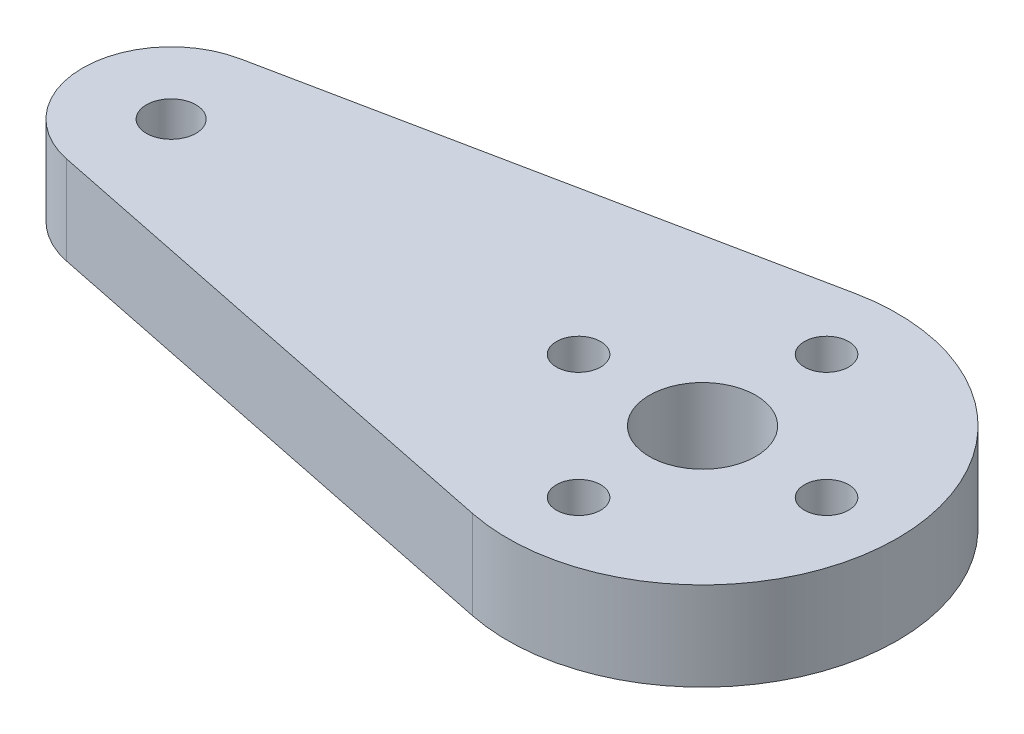
ISO-10303-21;
HEADER;
FILE_DESCRIPTION(('STEP AP214'),'2;1');
FILE_NAME('part.step','',(''),(''),'','','');
FILE_SCHEMA(('AUTOMOTIVE_DESIGN { 1 0 10303 214 1 1 1 1 }'));
ENDSEC;
DATA;
#1=APPLICATION_CONTEXT('core data for automotive mechanical design processes');
#2=APPLICATION_PROTOCOL_DEFINITION('international standard','automotive_design',2000,#1);
#3=PRODUCT_CONTEXT('',#1,'mechanical');
#4=PRODUCT('Part','Part','',(#3));
#5=PRODUCT_RELATED_PRODUCT_CATEGORY('part','',(#4));
#6=PRODUCT_DEFINITION_FORMATION('','',#4);
#7=PRODUCT_DEFINITION_CONTEXT('part definition',#1,'design');
#8=PRODUCT_DEFINITION('design','',#6,#7);
#9=PRODUCT_DEFINITION_SHAPE('','',#8);
#10=(LENGTH_UNIT() NAMED_UNIT(*) SI_UNIT(.MILLI.,.METRE.));
#11=(NAMED_UNIT(*) PLANE_ANGLE_UNIT() SI_UNIT($,.RADIAN.));
#12=(NAMED_UNIT(*) SI_UNIT($,.STERADIAN.) SOLID_ANGLE_UNIT());
#13=UNCERTAINTY_MEASURE_WITH_UNIT(LENGTH_MEASURE(1.E-05),#10,'distance_accuracy_value','');
#14=(GEOMETRIC_REPRESENTATION_CONTEXT(3) GLOBAL_UNCERTAINTY_ASSIGNED_CONTEXT((#13)) GLOBAL_UNIT_ASSIGNED_CONTEXT((#10,
#11,#12)) REPRESENTATION_CONTEXT('',''));
#15=CARTESIAN_POINT('',(0.,0.,0.));
#16=DIRECTION('',(0.,0.,1.));
#17=DIRECTION('',(1.,0.,0.));
#18=AXIS2_PLACEMENT_3D('',#15,#16,#17);
#19=CARTESIAN_POINT('',(0.,5.,0.));
#20=DIRECTION('',(0.,1.,0.));
#21=DIRECTION('',(0.,0.,-1.));
#22=AXIS2_PLACEMENT_3D('',#19,#20,#21);
#23=PLANE('',#22);
#24=CARTESIAN_POINT('',(37.,5.,0.));
#25=DIRECTION('',(0.,-1.,0.));
#26=DIRECTION('',(0.,0.,-1.));
#27=AXIS2_PLACEMENT_3D('',#24,#25,#26);
#28=CIRCLE('',#27,1.25);
#29=CARTESIAN_POINT('',(37.,5.,-1.25000000000005));
#30=VERTEX_POINT('',#29);
#31=EDGE_CURVE('E140',#30,#30,#28,.T.);
#32=ORIENTED_EDGE('',*,*,#31,.T.);
#33=EDGE_LOOP('',(#32));
#34=FACE_BOUND('',#33,.T.);
#35=CARTESIAN_POINT('',(0.,5.,0.));
#36=DIRECTION('',(0.,-1.,0.));
#37=DIRECTION('',(0.,0.,-1.));
#38=AXIS2_PLACEMENT_3D('',#35,#36,#37);
#39=CIRCLE('',#38,1.4);
#40=CARTESIAN_POINT('',(0.,5.,-1.4));
#41=VERTEX_POINT('',#40);
#42=EDGE_CURVE('E128',#41,#41,#39,.T.);
#43=ORIENTED_EDGE('',*,*,#42,.T.);
#44=EDGE_LOOP('',(#43));
#45=FACE_BOUND('',#44,.T.);
#46=CARTESIAN_POINT('',(30.,5.,0.));
#47=DIRECTION('',(0.,-1.,0.));
#48=DIRECTION('',(0.,0.,-1.));
#49=AXIS2_PLACEMENT_3D('',#46,#47,#48);
#50=CIRCLE('',#49,3.);
#51=CARTESIAN_POINT('',(30.,5.,-3.));
#52=VERTEX_POINT('',#51);
#53=EDGE_CURVE('E111',#52,#52,#50,.T.);
#54=ORIENTED_EDGE('',*,*,#53,.T.);
#55=EDGE_LOOP('',(#54));
#56=FACE_BOUND('',#55,.T.);
#57=CARTESIAN_POINT('',(0.,5.,0.));
#58=DIRECTION('',(0.,-1.,0.));
#59=DIRECTION('',(0.,0.,-1.));
#60=AXIS2_PLACEMENT_3D('',#57,#58,#59);
#61=CIRCLE('',#60,5.);
#62=CARTESIAN_POINT('',(-1.,5.,4.89897948556636));
#63=VERTEX_POINT('',#62);
#64=CARTESIAN_POINT('',(-1.,5.,-4.89897948556636));
#65=VERTEX_POINT('',#64);
#66=EDGE_CURVE('E99',#63,#65,#61,.T.);
#67=ORIENTED_EDGE('',*,*,#66,.F.);
#68=DIRECTION('',(-0.979795897113271,0.,-0.2));
#69=VECTOR('',#68,1.);
#70=CARTESIAN_POINT('',(-1.,5.,4.89897948556636));
#71=LINE('',#70,#69);
#72=CARTESIAN_POINT('',(27.8,5.,10.777754868246));
#73=VERTEX_POINT('',#72);
#74=EDGE_CURVE('E102',#73,#63,#71,.T.);
#75=ORIENTED_EDGE('',*,*,#74,.F.);
#76=CARTESIAN_POINT('',(30.,5.,0.));
#77=DIRECTION('',(0.,-1.,0.));
#78=DIRECTION('',(0.,0.,-1.));
#79=AXIS2_PLACEMENT_3D('',#76,#77,#78);
#80=CIRCLE('',#79,11.);
#81=CARTESIAN_POINT('',(27.8,5.,-10.777754868246));
#82=VERTEX_POINT('',#81);
#83=EDGE_CURVE('E90',#82,#73,#80,.T.);
#84=ORIENTED_EDGE('',*,*,#83,.F.);
#85=DIRECTION('',(0.979795897113271,0.,-0.2));
#86=VECTOR('',#85,1.);
#87=CARTESIAN_POINT('',(-1.,5.,-4.89897948556636));
#88=LINE('',#87,#86);
#89=EDGE_CURVE('E95',#65,#82,#88,.T.);
#90=ORIENTED_EDGE('',*,*,#89,.F.);
#91=EDGE_LOOP('',(#67,#75,#84,#90));
#92=FACE_BOUND('',#91,.T.);
#93=CARTESIAN_POINT('',(23.,5.,0.));
#94=DIRECTION('',(0.,-1.,0.));
#95=DIRECTION('',(0.,0.,-1.));
#96=AXIS2_PLACEMENT_3D('',#93,#94,#95);
#97=CIRCLE('',#96,1.25);
#98=CARTESIAN_POINT('',(23.,5.,-1.25));
#99=VERTEX_POINT('',#98);
#100=EDGE_CURVE('E122',#99,#99,#97,.T.);
#101=ORIENTED_EDGE('',*,*,#100,.T.);
#102=EDGE_LOOP('',(#101));
#103=FACE_BOUND('',#102,.T.);
#104=CARTESIAN_POINT('',(30.,5.,7.));
#105=DIRECTION('',(0.,-1.,0.));
#106=DIRECTION('',(0.,0.,-1.));
#107=AXIS2_PLACEMENT_3D('',#104,#105,#106);
#108=CIRCLE('',#107,1.25);
#109=CARTESIAN_POINT('',(30.,5.,5.75));
#110=VERTEX_POINT('',#109);
#111=EDGE_CURVE('E134',#110,#110,#108,.T.);
#112=ORIENTED_EDGE('',*,*,#111,.T.);
#113=EDGE_LOOP('',(#112));
#114=FACE_BOUND('',#113,.T.);
#115=CARTESIAN_POINT('',(29.9999999999999,5.,-7.));
#116=DIRECTION('',(0.,-1.,0.));
#117=DIRECTION('',(0.,0.,-1.));
#118=AXIS2_PLACEMENT_3D('',#115,#116,#117);
#119=CIRCLE('',#118,1.25);
#120=CARTESIAN_POINT('',(29.9999999999999,5.,-8.25));
#121=VERTEX_POINT('',#120);
#122=EDGE_CURVE('E146',#121,#121,#119,.T.);
#123=ORIENTED_EDGE('',*,*,#122,.T.);
#124=EDGE_LOOP('',(#123));
#125=FACE_BOUND('',#124,.T.);
#126=ADVANCED_FACE('F43',(#34,#45,#56,#92,#103,#114,#125),#23,.T.);
#127=CARTESIAN_POINT('',(0.,0.,0.));
#128=DIRECTION('',(0.,1.,0.));
#129=DIRECTION('',(0.,0.,-1.));
#130=AXIS2_PLACEMENT_3D('',#127,#128,#129);
#131=PLANE('',#130);
#132=CARTESIAN_POINT('',(0.,0.,0.));
#133=DIRECTION('',(0.,-1.,0.));
#134=DIRECTION('',(0.,0.,-1.));
#135=AXIS2_PLACEMENT_3D('',#132,#133,#134);
#136=CIRCLE('',#135,5.);
#137=CARTESIAN_POINT('',(-1.,0.,4.89897948556636));
#138=VERTEX_POINT('',#137);
#139=CARTESIAN_POINT('',(-1.,0.,-4.89897948556636));
#140=VERTEX_POINT('',#139);
#141=EDGE_CURVE('E107',#138,#140,#136,.T.);
#142=ORIENTED_EDGE('',*,*,#141,.T.);
#143=DIRECTION('',(0.979795897113271,0.,-0.2));
#144=VECTOR('',#143,1.);
#145=CARTESIAN_POINT('',(-1.,0.,-4.89897948556636));
#146=LINE('',#145,#144);
#147=CARTESIAN_POINT('',(27.8,0.,-10.777754868246));
#148=VERTEX_POINT('',#147);
#149=EDGE_CURVE('E110',#140,#148,#146,.T.);
#150=ORIENTED_EDGE('',*,*,#149,.T.);
#151=CARTESIAN_POINT('',(30.,0.,0.));
#152=DIRECTION('',(0.,-1.,0.));
#153=DIRECTION('',(0.,0.,-1.));
#154=AXIS2_PLACEMENT_3D('',#151,#152,#153);
#155=CIRCLE('',#154,11.);
#156=CARTESIAN_POINT('',(27.8,0.,10.777754868246));
#157=VERTEX_POINT('',#156);
#158=EDGE_CURVE('E93',#148,#157,#155,.T.);
#159=ORIENTED_EDGE('',*,*,#158,.T.);
#160=DIRECTION('',(-0.979795897113271,0.,-0.2));
#161=VECTOR('',#160,1.);
#162=CARTESIAN_POINT('',(-1.,0.,4.89897948556636));
#163=LINE('',#162,#161);
#164=EDGE_CURVE('E114',#157,#138,#163,.T.);
#165=ORIENTED_EDGE('',*,*,#164,.T.);
#166=EDGE_LOOP('',(#142,#150,#159,#165));
#167=FACE_BOUND('',#166,.T.);
#168=CARTESIAN_POINT('',(30.,0.,0.));
#169=DIRECTION('',(0.,-1.,0.));
#170=DIRECTION('',(0.,0.,-1.));
#171=AXIS2_PLACEMENT_3D('',#168,#169,#170);
#172=CIRCLE('',#171,3.);
#173=CARTESIAN_POINT('',(30.,0.,-3.));
#174=VERTEX_POINT('',#173);
#175=EDGE_CURVE('E119',#174,#174,#172,.T.);
#176=ORIENTED_EDGE('',*,*,#175,.F.);
#177=EDGE_LOOP('',(#176));
#178=FACE_BOUND('',#177,.T.);
#179=CARTESIAN_POINT('',(23.,0.,0.));
#180=DIRECTION('',(0.,-1.,0.));
#181=DIRECTION('',(0.,0.,-1.));
#182=AXIS2_PLACEMENT_3D('',#179,#180,#181);
#183=CIRCLE('',#182,1.25);
#184=CARTESIAN_POINT('',(23.,0.,-1.25));
#185=VERTEX_POINT('',#184);
#186=EDGE_CURVE('E125',#185,#185,#183,.T.);
#187=ORIENTED_EDGE('',*,*,#186,.F.);
#188=EDGE_LOOP('',(#187));
#189=FACE_BOUND('',#188,.T.);
#190=CARTESIAN_POINT('',(0.,0.,0.));
#191=DIRECTION('',(0.,-1.,0.));
#192=DIRECTION('',(0.,0.,-1.));
#193=AXIS2_PLACEMENT_3D('',#190,#191,#192);
#194=CIRCLE('',#193,1.4);
#195=CARTESIAN_POINT('',(0.,0.,-1.4));
#196=VERTEX_POINT('',#195);
#197=EDGE_CURVE('E131',#196,#196,#194,.T.);
#198=ORIENTED_EDGE('',*,*,#197,.F.);
#199=EDGE_LOOP('',(#198));
#200=FACE_BOUND('',#199,.T.);
#201=CARTESIAN_POINT('',(30.,0.,7.));
#202=DIRECTION('',(0.,-1.,0.));
#203=DIRECTION('',(0.,0.,-1.));
#204=AXIS2_PLACEMENT_3D('',#201,#202,#203);
#205=CIRCLE('',#204,1.25);
#206=CARTESIAN_POINT('',(30.,0.,5.75));
#207=VERTEX_POINT('',#206);
#208=EDGE_CURVE('E137',#207,#207,#205,.T.);
#209=ORIENTED_EDGE('',*,*,#208,.F.);
#210=EDGE_LOOP('',(#209));
#211=FACE_BOUND('',#210,.T.);
#212=CARTESIAN_POINT('',(37.,0.,0.));
#213=DIRECTION('',(0.,-1.,0.));
#214=DIRECTION('',(0.,0.,-1.));
#215=AXIS2_PLACEMENT_3D('',#212,#213,#214);
#216=CIRCLE('',#215,1.25);
#217=CARTESIAN_POINT('',(37.,0.,-1.25000000000005));
#218=VERTEX_POINT('',#217);
#219=EDGE_CURVE('E143',#218,#218,#216,.T.);
#220=ORIENTED_EDGE('',*,*,#219,.F.);
#221=EDGE_LOOP('',(#220));
#222=FACE_BOUND('',#221,.T.);
#223=CARTESIAN_POINT('',(29.9999999999999,0.,-7.));
#224=DIRECTION('',(0.,-1.,0.));
#225=DIRECTION('',(0.,0.,-1.));
#226=AXIS2_PLACEMENT_3D('',#223,#224,#225);
#227=CIRCLE('',#226,1.25);
#228=CARTESIAN_POINT('',(29.9999999999999,0.,-8.25));
#229=VERTEX_POINT('',#228);
#230=EDGE_CURVE('E149',#229,#229,#227,.T.);
#231=ORIENTED_EDGE('',*,*,#230,.F.);
#232=EDGE_LOOP('',(#231));
#233=FACE_BOUND('',#232,.T.);
#234=ADVANCED_FACE('F163',(#167,#178,#189,#200,#211,#222,#233),#131,.F.);
#235=CARTESIAN_POINT('',(0.,5.,0.));
#236=DIRECTION('',(0.,-1.,0.));
#237=DIRECTION('',(0.,0.,1.));
#238=AXIS2_PLACEMENT_3D('',#235,#236,#237);
#239=CYLINDRICAL_SURFACE('',#238,5.);
#240=ORIENTED_EDGE('',*,*,#141,.F.);
#241=DIRECTION('',(0.,-1.,0.));
#242=VECTOR('',#241,1.);
#243=CARTESIAN_POINT('',(-1.,5.,4.89897948556636));
#244=LINE('',#243,#242);
#245=EDGE_CURVE('E60',#63,#138,#244,.T.);
#246=ORIENTED_EDGE('',*,*,#245,.F.);
#247=ORIENTED_EDGE('',*,*,#66,.T.);
#248=DIRECTION('',(0.,-1.,0.));
#249=VECTOR('',#248,1.);
#250=CARTESIAN_POINT('',(-1.,5.,-4.89897948556636));
#251=LINE('',#250,#249);
#252=EDGE_CURVE('E11',#65,#140,#251,.T.);
#253=ORIENTED_EDGE('',*,*,#252,.T.);
#254=EDGE_LOOP('',(#240,#246,#247,#253));
#255=FACE_BOUND('',#254,.T.);
#256=ADVANCED_FACE('F45',(#255),#239,.T.);
#257=CARTESIAN_POINT('',(-1.,5.,-4.89897948556636));
#258=DIRECTION('',(0.2,0.,0.979795897113271));
#259=DIRECTION('',(-0.979795897113271,0.,0.2));
#260=AXIS2_PLACEMENT_3D('',#257,#258,#259);
#261=PLANE('',#260);
#262=ORIENTED_EDGE('',*,*,#149,.F.);
#263=ORIENTED_EDGE('',*,*,#252,.F.);
#264=ORIENTED_EDGE('',*,*,#89,.T.);
#265=DIRECTION('',(0.,-1.,0.));
#266=VECTOR('',#265,1.);
#267=CARTESIAN_POINT('',(27.8,5.,-10.777754868246));
#268=LINE('',#267,#266);
#269=EDGE_CURVE('E52',#82,#148,#268,.T.);
#270=ORIENTED_EDGE('',*,*,#269,.T.);
#271=EDGE_LOOP('',(#262,#263,#264,#270));
#272=FACE_BOUND('',#271,.T.);
#273=ADVANCED_FACE('F96',(#272),#261,.F.);
#274=CARTESIAN_POINT('',(30.,5.,0.));
#275=DIRECTION('',(0.,-1.,0.));
#276=DIRECTION('',(0.,0.,1.));
#277=AXIS2_PLACEMENT_3D('',#274,#275,#276);
#278=CYLINDRICAL_SURFACE('',#277,11.);
#279=ORIENTED_EDGE('',*,*,#158,.F.);
#280=ORIENTED_EDGE('',*,*,#269,.F.);
#281=ORIENTED_EDGE('',*,*,#83,.T.);
#282=DIRECTION('',(0.,-1.,0.));
#283=VECTOR('',#282,1.);
#284=CARTESIAN_POINT('',(27.8,5.,10.777754868246));
#285=LINE('',#284,#283);
#286=EDGE_CURVE('E76',#73,#157,#285,.T.);
#287=ORIENTED_EDGE('',*,*,#286,.T.);
#288=EDGE_LOOP('',(#279,#280,#281,#287));
#289=FACE_BOUND('',#288,.T.);
#290=ADVANCED_FACE('F88',(#289),#278,.T.);
#291=CARTESIAN_POINT('',(-1.,5.,4.89897948556636));
#292=DIRECTION('',(0.2,0.,-0.979795897113271));
#293=DIRECTION('',(0.979795897113271,0.,0.2));
#294=AXIS2_PLACEMENT_3D('',#291,#292,#293);
#295=PLANE('',#294);
#296=ORIENTED_EDGE('',*,*,#164,.F.);
#297=ORIENTED_EDGE('',*,*,#286,.F.);
#298=ORIENTED_EDGE('',*,*,#74,.T.);
#299=ORIENTED_EDGE('',*,*,#245,.T.);
#300=EDGE_LOOP('',(#296,#297,#298,#299));
#301=FACE_BOUND('',#300,.T.);
#302=ADVANCED_FACE('F175',(#301),#295,.F.);
#303=CARTESIAN_POINT('',(30.,5.,0.));
#304=DIRECTION('',(0.,-1.,0.));
#305=DIRECTION('',(0.,0.,1.));
#306=AXIS2_PLACEMENT_3D('',#303,#304,#305);
#307=CYLINDRICAL_SURFACE('',#306,3.);
#308=ORIENTED_EDGE('',*,*,#53,.F.);
#309=EDGE_LOOP('',(#308));
#310=FACE_BOUND('',#309,.T.);
#311=ORIENTED_EDGE('',*,*,#175,.T.);
#312=EDGE_LOOP('',(#311));
#313=FACE_BOUND('',#312,.T.);
#314=ADVANCED_FACE('F178',(#310,#313),#307,.F.);
#315=CARTESIAN_POINT('',(23.,5.,0.));
#316=DIRECTION('',(0.,-1.,0.));
#317=DIRECTION('',(0.,0.,1.));
#318=AXIS2_PLACEMENT_3D('',#315,#316,#317);
#319=CYLINDRICAL_SURFACE('',#318,1.25);
#320=ORIENTED_EDGE('',*,*,#100,.F.);
#321=EDGE_LOOP('',(#320));
#322=FACE_BOUND('',#321,.T.);
#323=ORIENTED_EDGE('',*,*,#186,.T.);
#324=EDGE_LOOP('',(#323));
#325=FACE_BOUND('',#324,.T.);
#326=ADVANCED_FACE('F202',(#322,#325),#319,.F.);
#327=CARTESIAN_POINT('',(0.,5.,0.));
#328=DIRECTION('',(0.,-1.,0.));
#329=DIRECTION('',(0.,0.,1.));
#330=AXIS2_PLACEMENT_3D('',#327,#328,#329);
#331=CYLINDRICAL_SURFACE('',#330,1.4);
#332=ORIENTED_EDGE('',*,*,#42,.F.);
#333=EDGE_LOOP('',(#332));
#334=FACE_BOUND('',#333,.T.);
#335=ORIENTED_EDGE('',*,*,#197,.T.);
#336=EDGE_LOOP('',(#335));
#337=FACE_BOUND('',#336,.T.);
#338=ADVANCED_FACE('F210',(#334,#337),#331,.F.);
#339=CARTESIAN_POINT('',(30.,5.,7.));
#340=DIRECTION('',(0.,-1.,0.));
#341=DIRECTION('',(0.,0.,1.));
#342=AXIS2_PLACEMENT_3D('',#339,#340,#341);
#343=CYLINDRICAL_SURFACE('',#342,1.25);
#344=ORIENTED_EDGE('',*,*,#111,.F.);
#345=EDGE_LOOP('',(#344));
#346=FACE_BOUND('',#345,.T.);
#347=ORIENTED_EDGE('',*,*,#208,.T.);
#348=EDGE_LOOP('',(#347));
#349=FACE_BOUND('',#348,.T.);
#350=ADVANCED_FACE('F219',(#346,#349),#343,.F.);
#351=CARTESIAN_POINT('',(37.,5.,0.));
#352=DIRECTION('',(0.,-1.,0.));
#353=DIRECTION('',(0.,0.,1.));
#354=AXIS2_PLACEMENT_3D('',#351,#352,#353);
#355=CYLINDRICAL_SURFACE('',#354,1.25);
#356=ORIENTED_EDGE('',*,*,#31,.F.);
#357=EDGE_LOOP('',(#356));
#358=FACE_BOUND('',#357,.T.);
#359=ORIENTED_EDGE('',*,*,#219,.T.);
#360=EDGE_LOOP('',(#359));
#361=FACE_BOUND('',#360,.T.);
#362=ADVANCED_FACE('F159',(#358,#361),#355,.F.);
#363=CARTESIAN_POINT('',(29.9999999999999,5.,-7.));
#364=DIRECTION('',(0.,-1.,0.));
#365=DIRECTION('',(0.,0.,1.));
#366=AXIS2_PLACEMENT_3D('',#363,#364,#365);
#367=CYLINDRICAL_SURFACE('',#366,1.25);
#368=ORIENTED_EDGE('',*,*,#122,.F.);
#369=EDGE_LOOP('',(#368));
#370=FACE_BOUND('',#369,.T.);
#371=ORIENTED_EDGE('',*,*,#230,.T.);
#372=EDGE_LOOP('',(#371));
#373=FACE_BOUND('',#372,.T.);
#374=ADVANCED_FACE('F156',(#370,#373),#367,.F.);
#375=CLOSED_SHELL('',(#126,#234,#256,#273,#290,#302,#314,#326,#338,#350,#362,#374));
#376=MANIFOLD_SOLID_BREP('B2',#375);
#377=ADVANCED_BREP_SHAPE_REPRESENTATION('',(#18,#376),#14);
#378=SHAPE_DEFINITION_REPRESENTATION(#9,#377);
ENDSEC;
END-ISO-10303-21;
